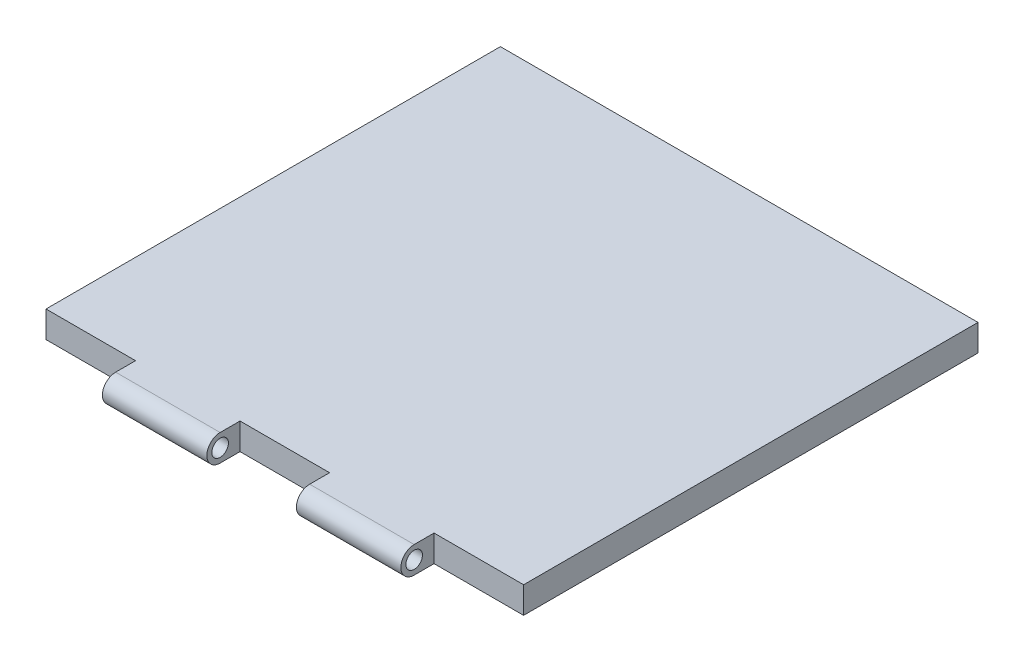
ISO-10303-21;
HEADER;
FILE_DESCRIPTION(('STEP AP214'),'2;1');
FILE_NAME('part.step','',(''),(''),'','','');
FILE_SCHEMA(('AUTOMOTIVE_DESIGN { 1 0 10303 214 1 1 1 1 }'));
ENDSEC;
DATA;
#1=APPLICATION_CONTEXT('core data for automotive mechanical design processes');
#2=APPLICATION_PROTOCOL_DEFINITION('international standard','automotive_design',2000,#1);
#3=PRODUCT_CONTEXT('',#1,'mechanical');
#4=PRODUCT('Part','Part','',(#3));
#5=PRODUCT_RELATED_PRODUCT_CATEGORY('part','',(#4));
#6=PRODUCT_DEFINITION_FORMATION('','',#4);
#7=PRODUCT_DEFINITION_CONTEXT('part definition',#1,'design');
#8=PRODUCT_DEFINITION('design','',#6,#7);
#9=PRODUCT_DEFINITION_SHAPE('','',#8);
#10=(LENGTH_UNIT() NAMED_UNIT(*) SI_UNIT(.MILLI.,.METRE.));
#11=(NAMED_UNIT(*) PLANE_ANGLE_UNIT() SI_UNIT($,.RADIAN.));
#12=(NAMED_UNIT(*) SI_UNIT($,.STERADIAN.) SOLID_ANGLE_UNIT());
#13=UNCERTAINTY_MEASURE_WITH_UNIT(LENGTH_MEASURE(1.E-05),#10,'distance_accuracy_value','');
#14=(GEOMETRIC_REPRESENTATION_CONTEXT(3) GLOBAL_UNCERTAINTY_ASSIGNED_CONTEXT((#13)) GLOBAL_UNIT_ASSIGNED_CONTEXT((#10,
#11,#12)) REPRESENTATION_CONTEXT('',''));
#15=CARTESIAN_POINT('',(0.,0.,0.));
#16=DIRECTION('',(0.,0.,1.));
#17=DIRECTION('',(1.,0.,0.));
#18=AXIS2_PLACEMENT_3D('',#15,#16,#17);
#19=CARTESIAN_POINT('',(36.,-1.14263199369577,-35.75));
#20=DIRECTION('',(0.,1.,0.));
#21=DIRECTION('',(0.,0.,1.));
#22=AXIS2_PLACEMENT_3D('',#19,#20,#21);
#23=PLANE('',#22);
#24=DIRECTION('',(0.,0.,-1.));
#25=VECTOR('',#24,1.);
#26=CARTESIAN_POINT('',(-22.5,-1.14263199369578,32.75));
#27=LINE('',#26,#25);
#28=CARTESIAN_POINT('',(-22.5,-1.14263199369578,35.75));
#29=VERTEX_POINT('',#28);
#30=CARTESIAN_POINT('',(-22.5,-1.14263199369578,32.75));
#31=VERTEX_POINT('',#30);
#32=EDGE_CURVE('E177',#29,#31,#27,.T.);
#33=ORIENTED_EDGE('',*,*,#32,.T.);
#34=DIRECTION('',(-1.,0.,0.));
#35=VECTOR('',#34,1.);
#36=CARTESIAN_POINT('',(-36.,-1.14263199369578,32.75));
#37=LINE('',#36,#35);
#38=CARTESIAN_POINT('',(-36.,-1.14263199369578,32.75));
#39=VERTEX_POINT('',#38);
#40=EDGE_CURVE('E180',#31,#39,#37,.T.);
#41=ORIENTED_EDGE('',*,*,#40,.T.);
#42=DIRECTION('',(0.,0.,-1.));
#43=VECTOR('',#42,1.);
#44=CARTESIAN_POINT('',(-36.,-1.14263199369577,-35.75));
#45=LINE('',#44,#43);
#46=CARTESIAN_POINT('',(-36.,-1.14263199369577,-35.75));
#47=VERTEX_POINT('',#46);
#48=EDGE_CURVE('E231',#39,#47,#45,.T.);
#49=ORIENTED_EDGE('',*,*,#48,.T.);
#50=DIRECTION('',(-1.,0.,0.));
#51=VECTOR('',#50,1.);
#52=CARTESIAN_POINT('',(36.,-1.14263199369577,-35.75));
#53=LINE('',#52,#51);
#54=CARTESIAN_POINT('',(36.,-1.14263199369577,-35.75));
#55=VERTEX_POINT('',#54);
#56=EDGE_CURVE('E252',#55,#47,#53,.T.);
#57=ORIENTED_EDGE('',*,*,#56,.F.);
#58=DIRECTION('',(0.,0.,-1.));
#59=VECTOR('',#58,1.);
#60=CARTESIAN_POINT('',(36.,-1.14263199369577,-35.75));
#61=LINE('',#60,#59);
#62=CARTESIAN_POINT('',(36.,-1.14263199369578,32.75));
#63=VERTEX_POINT('',#62);
#64=EDGE_CURVE('E232',#63,#55,#61,.T.);
#65=ORIENTED_EDGE('',*,*,#64,.F.);
#66=DIRECTION('',(-1.,0.,0.));
#67=VECTOR('',#66,1.);
#68=CARTESIAN_POINT('',(36.,-1.14263199369578,32.75));
#69=LINE('',#68,#67);
#70=CARTESIAN_POINT('',(22.5,-1.14263199369578,32.75));
#71=VERTEX_POINT('',#70);
#72=EDGE_CURVE('E196',#63,#71,#69,.T.);
#73=ORIENTED_EDGE('',*,*,#72,.T.);
#74=DIRECTION('',(0.,0.,1.));
#75=VECTOR('',#74,1.);
#76=CARTESIAN_POINT('',(22.5,-1.14263199369578,32.75));
#77=LINE('',#76,#75);
#78=CARTESIAN_POINT('',(22.5,-1.14263199369578,35.75));
#79=VERTEX_POINT('',#78);
#80=EDGE_CURVE('E199',#71,#79,#77,.T.);
#81=ORIENTED_EDGE('',*,*,#80,.T.);
#82=DIRECTION('',(-1.,0.,0.));
#83=VECTOR('',#82,1.);
#84=CARTESIAN_POINT('',(36.,-1.14263199369578,35.75));
#85=LINE('',#84,#83);
#86=CARTESIAN_POINT('',(6.75,-1.14263199369578,35.75));
#87=VERTEX_POINT('',#86);
#88=EDGE_CURVE('E11',#79,#87,#85,.T.);
#89=ORIENTED_EDGE('',*,*,#88,.T.);
#90=DIRECTION('',(0.,0.,-1.));
#91=VECTOR('',#90,1.);
#92=CARTESIAN_POINT('',(6.75,-1.14263199369578,32.75));
#93=LINE('',#92,#91);
#94=CARTESIAN_POINT('',(6.75,-1.14263199369578,32.75));
#95=VERTEX_POINT('',#94);
#96=EDGE_CURVE('E211',#87,#95,#93,.T.);
#97=ORIENTED_EDGE('',*,*,#96,.T.);
#98=DIRECTION('',(-1.,0.,0.));
#99=VECTOR('',#98,1.);
#100=CARTESIAN_POINT('',(-6.75,-1.14263199369578,32.75));
#101=LINE('',#100,#99);
#102=CARTESIAN_POINT('',(-6.75,-1.14263199369578,32.75));
#103=VERTEX_POINT('',#102);
#104=EDGE_CURVE('E214',#95,#103,#101,.T.);
#105=ORIENTED_EDGE('',*,*,#104,.T.);
#106=DIRECTION('',(0.,0.,1.));
#107=VECTOR('',#106,1.);
#108=CARTESIAN_POINT('',(-6.75,-1.14263199369578,32.75));
#109=LINE('',#108,#107);
#110=CARTESIAN_POINT('',(-6.75,-1.14263199369578,35.75));
#111=VERTEX_POINT('',#110);
#112=EDGE_CURVE('E208',#103,#111,#109,.T.);
#113=ORIENTED_EDGE('',*,*,#112,.T.);
#114=EDGE_CURVE('E44',#111,#29,#85,.T.);
#115=ORIENTED_EDGE('',*,*,#114,.T.);
#116=EDGE_LOOP('',(#33,#41,#49,#57,#65,#73,#81,#89,#97,#105,#113,#115));
#117=FACE_BOUND('',#116,.T.);
#118=DIRECTION('',(0.,0.,1.));
#119=VECTOR('',#118,1.);
#120=CARTESIAN_POINT('',(30.,-1.14263199369578,-19.8082953249715));
#121=LINE('',#120,#119);
#122=CARTESIAN_POINT('',(30.,-1.14263199369578,-30.8763302926644));
#123=VERTEX_POINT('',#122);
#124=CARTESIAN_POINT('',(30.,-1.14263199369578,-19.8082953249715));
#125=VERTEX_POINT('',#124);
#126=EDGE_CURVE('E151',#123,#125,#121,.T.);
#127=ORIENTED_EDGE('',*,*,#126,.F.);
#128=DIRECTION('',(-1.,0.,0.));
#129=VECTOR('',#128,1.);
#130=CARTESIAN_POINT('',(30.,-1.14263199369578,-30.8763302926644));
#131=LINE('',#130,#129);
#132=CARTESIAN_POINT('',(-30.,-1.14263199369578,-30.8763302926644));
#133=VERTEX_POINT('',#132);
#134=EDGE_CURVE('E168',#123,#133,#131,.T.);
#135=ORIENTED_EDGE('',*,*,#134,.T.);
#136=DIRECTION('',(0.,0.,1.));
#137=VECTOR('',#136,1.);
#138=CARTESIAN_POINT('',(-30.,-1.14263199369578,-19.8082953249715));
#139=LINE('',#138,#137);
#140=CARTESIAN_POINT('',(-30.,-1.14263199369577,-19.8082953249715));
#141=VERTEX_POINT('',#140);
#142=EDGE_CURVE('E162',#133,#141,#139,.T.);
#143=ORIENTED_EDGE('',*,*,#142,.T.);
#144=DIRECTION('',(-1.,0.,0.));
#145=VECTOR('',#144,1.);
#146=CARTESIAN_POINT('',(30.,-1.14263199369578,-19.8082953249715));
#147=LINE('',#146,#145);
#148=EDGE_CURVE('E52',#125,#141,#147,.T.);
#149=ORIENTED_EDGE('',*,*,#148,.F.);
#150=EDGE_LOOP('',(#127,#135,#143,#149));
#151=FACE_BOUND('',#150,.T.);
#152=ADVANCED_FACE('F35',(#117,#151),#23,.F.);
#153=CARTESIAN_POINT('',(36.,0.857368006304226,35.75));
#154=DIRECTION('',(-1.,0.,0.));
#155=DIRECTION('',(0.,0.,1.));
#156=AXIS2_PLACEMENT_3D('',#153,#154,#155);
#157=CYLINDRICAL_SURFACE('',#156,2.);
#158=DIRECTION('',(-1.,0.,0.));
#159=VECTOR('',#158,1.);
#160=CARTESIAN_POINT('',(36.,2.85736800630423,35.75));
#161=LINE('',#160,#159);
#162=CARTESIAN_POINT('',(-6.75,2.85736800630424,35.75));
#163=VERTEX_POINT('',#162);
#164=CARTESIAN_POINT('',(-22.5,2.85736800630423,35.75));
#165=VERTEX_POINT('',#164);
#166=EDGE_CURVE('E240',#163,#165,#161,.T.);
#167=ORIENTED_EDGE('',*,*,#166,.T.);
#168=CARTESIAN_POINT('',(-22.5,0.857368006304226,35.75));
#169=DIRECTION('',(1.,0.,0.));
#170=DIRECTION('',(0.,0.,-1.));
#171=AXIS2_PLACEMENT_3D('',#168,#169,#170);
#172=CIRCLE('',#171,2.);
#173=EDGE_CURVE('E229',#165,#29,#172,.T.);
#174=ORIENTED_EDGE('',*,*,#173,.T.);
#175=ORIENTED_EDGE('',*,*,#114,.F.);
#176=CARTESIAN_POINT('',(-6.75,0.857368006304226,35.75));
#177=DIRECTION('',(-1.,0.,0.));
#178=DIRECTION('',(0.,0.,1.));
#179=AXIS2_PLACEMENT_3D('',#176,#177,#178);
#180=CIRCLE('',#179,2.);
#181=EDGE_CURVE('E224',#111,#163,#180,.T.);
#182=ORIENTED_EDGE('',*,*,#181,.T.);
#183=EDGE_LOOP('',(#167,#174,#175,#182));
#184=FACE_BOUND('',#183,.T.);
#185=ADVANCED_FACE('F313',(#184),#157,.T.);
#186=CARTESIAN_POINT('',(36.,0.857368006304226,35.75));
#187=DIRECTION('',(-1.,0.,0.));
#188=DIRECTION('',(0.,0.,1.));
#189=AXIS2_PLACEMENT_3D('',#186,#187,#188);
#190=PLANE('',#189);
#191=DIRECTION('',(0.,0.,1.));
#192=VECTOR('',#191,1.);
#193=CARTESIAN_POINT('',(36.,2.85736800630423,35.75));
#194=LINE('',#193,#192);
#195=CARTESIAN_POINT('',(36.,2.85736800630424,-35.75));
#196=VERTEX_POINT('',#195);
#197=CARTESIAN_POINT('',(36.,2.85736800630423,32.75));
#198=VERTEX_POINT('',#197);
#199=EDGE_CURVE('E237',#196,#198,#194,.T.);
#200=ORIENTED_EDGE('',*,*,#199,.T.);
#201=DIRECTION('',(0.,1.,0.));
#202=VECTOR('',#201,1.);
#203=CARTESIAN_POINT('',(36.,-1.14263199369578,32.75));
#204=LINE('',#203,#202);
#205=EDGE_CURVE('E60',#63,#198,#204,.T.);
#206=ORIENTED_EDGE('',*,*,#205,.F.);
#207=ORIENTED_EDGE('',*,*,#64,.T.);
#208=DIRECTION('',(0.,1.,0.));
#209=VECTOR('',#208,1.);
#210=CARTESIAN_POINT('',(36.,2.85736800630424,-35.75));
#211=LINE('',#210,#209);
#212=EDGE_CURVE('E234',#55,#196,#211,.T.);
#213=ORIENTED_EDGE('',*,*,#212,.T.);
#214=EDGE_LOOP('',(#200,#206,#207,#213));
#215=FACE_BOUND('',#214,.T.);
#216=ADVANCED_FACE('F317',(#215),#190,.F.);
#217=CARTESIAN_POINT('',(-36.,0.857368006304226,35.75));
#218=DIRECTION('',(-1.,0.,0.));
#219=DIRECTION('',(0.,0.,1.));
#220=AXIS2_PLACEMENT_3D('',#217,#218,#219);
#221=PLANE('',#220);
#222=DIRECTION('',(0.,1.,0.));
#223=VECTOR('',#222,1.);
#224=CARTESIAN_POINT('',(-36.,-1.14263199369578,32.75));
#225=LINE('',#224,#223);
#226=CARTESIAN_POINT('',(-36.,2.85736800630424,32.75));
#227=VERTEX_POINT('',#226);
#228=EDGE_CURVE('E184',#39,#227,#225,.T.);
#229=ORIENTED_EDGE('',*,*,#228,.T.);
#230=DIRECTION('',(0.,0.,1.));
#231=VECTOR('',#230,1.);
#232=CARTESIAN_POINT('',(-36.,2.85736800630423,35.75));
#233=LINE('',#232,#231);
#234=CARTESIAN_POINT('',(-36.,2.85736800630424,-35.75));
#235=VERTEX_POINT('',#234);
#236=EDGE_CURVE('E235',#235,#227,#233,.T.);
#237=ORIENTED_EDGE('',*,*,#236,.F.);
#238=DIRECTION('',(0.,1.,0.));
#239=VECTOR('',#238,1.);
#240=CARTESIAN_POINT('',(-36.,2.85736800630424,-35.75));
#241=LINE('',#240,#239);
#242=EDGE_CURVE('E242',#47,#235,#241,.T.);
#243=ORIENTED_EDGE('',*,*,#242,.F.);
#244=ORIENTED_EDGE('',*,*,#48,.F.);
#245=EDGE_LOOP('',(#229,#237,#243,#244));
#246=FACE_BOUND('',#245,.T.);
#247=ADVANCED_FACE('F326',(#246),#221,.T.);
#248=CARTESIAN_POINT('',(22.5,0.857368006304226,35.75));
#249=DIRECTION('',(-1.,0.,0.));
#250=DIRECTION('',(0.,0.,1.));
#251=AXIS2_PLACEMENT_3D('',#248,#249,#250);
#252=CIRCLE('',#251,2.);
#253=CARTESIAN_POINT('',(22.5,2.85736800630424,35.75));
#254=VERTEX_POINT('',#253);
#255=EDGE_CURVE('E227',#79,#254,#252,.T.);
#256=ORIENTED_EDGE('',*,*,#255,.T.);
#257=CARTESIAN_POINT('',(6.75,2.85736800630423,35.75));
#258=VERTEX_POINT('',#257);
#259=EDGE_CURVE('E248',#254,#258,#161,.T.);
#260=ORIENTED_EDGE('',*,*,#259,.T.);
#261=CARTESIAN_POINT('',(6.75,0.857368006304226,35.75));
#262=DIRECTION('',(1.,0.,0.));
#263=DIRECTION('',(0.,0.,-1.));
#264=AXIS2_PLACEMENT_3D('',#261,#262,#263);
#265=CIRCLE('',#264,2.);
#266=EDGE_CURVE('E221',#258,#87,#265,.T.);
#267=ORIENTED_EDGE('',*,*,#266,.T.);
#268=ORIENTED_EDGE('',*,*,#88,.F.);
#269=EDGE_LOOP('',(#256,#260,#267,#268));
#270=FACE_BOUND('',#269,.T.);
#271=ADVANCED_FACE('F37',(#270),#157,.T.);
#272=CARTESIAN_POINT('',(36.,2.85736800630424,-35.75));
#273=DIRECTION('',(0.,0.,1.));
#274=DIRECTION('',(1.,0.,0.));
#275=AXIS2_PLACEMENT_3D('',#272,#273,#274);
#276=PLANE('',#275);
#277=ORIENTED_EDGE('',*,*,#242,.T.);
#278=DIRECTION('',(-1.,0.,0.));
#279=VECTOR('',#278,1.);
#280=CARTESIAN_POINT('',(36.,2.85736800630424,-35.75));
#281=LINE('',#280,#279);
#282=EDGE_CURVE('E249',#196,#235,#281,.T.);
#283=ORIENTED_EDGE('',*,*,#282,.F.);
#284=ORIENTED_EDGE('',*,*,#212,.F.);
#285=ORIENTED_EDGE('',*,*,#56,.T.);
#286=EDGE_LOOP('',(#277,#283,#284,#285));
#287=FACE_BOUND('',#286,.T.);
#288=ADVANCED_FACE('F320',(#287),#276,.F.);
#289=CARTESIAN_POINT('',(36.,2.85736800630423,35.75));
#290=DIRECTION('',(0.,-1.,0.));
#291=DIRECTION('',(0.,0.,-1.));
#292=AXIS2_PLACEMENT_3D('',#289,#290,#291);
#293=PLANE('',#292);
#294=ORIENTED_EDGE('',*,*,#236,.T.);
#295=DIRECTION('',(-1.,0.,0.));
#296=VECTOR('',#295,1.);
#297=CARTESIAN_POINT('',(-36.,2.85736800630424,32.75));
#298=LINE('',#297,#296);
#299=CARTESIAN_POINT('',(-22.5,2.85736800630424,32.75));
#300=VERTEX_POINT('',#299);
#301=EDGE_CURVE('E174',#300,#227,#298,.T.);
#302=ORIENTED_EDGE('',*,*,#301,.F.);
#303=DIRECTION('',(0.,0.,-1.));
#304=VECTOR('',#303,1.);
#305=CARTESIAN_POINT('',(-22.5,2.85736800630424,32.75));
#306=LINE('',#305,#304);
#307=EDGE_CURVE('E172',#165,#300,#306,.T.);
#308=ORIENTED_EDGE('',*,*,#307,.F.);
#309=ORIENTED_EDGE('',*,*,#166,.F.);
#310=DIRECTION('',(0.,0.,1.));
#311=VECTOR('',#310,1.);
#312=CARTESIAN_POINT('',(-6.75,2.85736800630424,32.75));
#313=LINE('',#312,#311);
#314=CARTESIAN_POINT('',(-6.75,2.85736800630424,32.75));
#315=VERTEX_POINT('',#314);
#316=EDGE_CURVE('E163',#315,#163,#313,.T.);
#317=ORIENTED_EDGE('',*,*,#316,.F.);
#318=DIRECTION('',(-1.,0.,0.));
#319=VECTOR('',#318,1.);
#320=CARTESIAN_POINT('',(-6.75,2.85736800630424,32.75));
#321=LINE('',#320,#319);
#322=CARTESIAN_POINT('',(6.75,2.85736800630424,32.75));
#323=VERTEX_POINT('',#322);
#324=EDGE_CURVE('E205',#323,#315,#321,.T.);
#325=ORIENTED_EDGE('',*,*,#324,.F.);
#326=DIRECTION('',(0.,0.,-1.));
#327=VECTOR('',#326,1.);
#328=CARTESIAN_POINT('',(6.75,2.85736800630424,32.75));
#329=LINE('',#328,#327);
#330=EDGE_CURVE('E166',#258,#323,#329,.T.);
#331=ORIENTED_EDGE('',*,*,#330,.F.);
#332=ORIENTED_EDGE('',*,*,#259,.F.);
#333=DIRECTION('',(0.,0.,1.));
#334=VECTOR('',#333,1.);
#335=CARTESIAN_POINT('',(22.5,2.85736800630424,32.75));
#336=LINE('',#335,#334);
#337=CARTESIAN_POINT('',(22.5,2.85736800630424,32.75));
#338=VERTEX_POINT('',#337);
#339=EDGE_CURVE('E192',#338,#254,#336,.T.);
#340=ORIENTED_EDGE('',*,*,#339,.F.);
#341=DIRECTION('',(-1.,0.,0.));
#342=VECTOR('',#341,1.);
#343=CARTESIAN_POINT('',(36.,2.85736800630424,32.75));
#344=LINE('',#343,#342);
#345=EDGE_CURVE('E190',#198,#338,#344,.T.);
#346=ORIENTED_EDGE('',*,*,#345,.F.);
#347=ORIENTED_EDGE('',*,*,#199,.F.);
#348=ORIENTED_EDGE('',*,*,#282,.T.);
#349=EDGE_LOOP('',(#294,#302,#308,#309,#317,#325,#331,#332,#340,#346,#347,#348));
#350=FACE_BOUND('',#349,.T.);
#351=ADVANCED_FACE('F288',(#350),#293,.F.);
#352=CARTESIAN_POINT('',(-6.75,-1.14263199369578,32.75));
#353=DIRECTION('',(-1.,0.,0.));
#354=DIRECTION('',(0.,0.,1.));
#355=AXIS2_PLACEMENT_3D('',#352,#353,#354);
#356=PLANE('',#355);
#357=CARTESIAN_POINT('',(-6.75,0.857368006304226,35.75));
#358=DIRECTION('',(-1.,0.,0.));
#359=DIRECTION('',(0.,0.,1.));
#360=AXIS2_PLACEMENT_3D('',#357,#358,#359);
#361=CIRCLE('',#360,1.25);
#362=CARTESIAN_POINT('',(-6.75,0.857368006304226,37.));
#363=VERTEX_POINT('',#362);
#364=EDGE_CURVE('E223',#363,#363,#361,.T.);
#365=ORIENTED_EDGE('',*,*,#364,.T.);
#366=EDGE_LOOP('',(#365));
#367=FACE_BOUND('',#366,.T.);
#368=ORIENTED_EDGE('',*,*,#181,.F.);
#369=ORIENTED_EDGE('',*,*,#112,.F.);
#370=DIRECTION('',(0.,1.,0.));
#371=VECTOR('',#370,1.);
#372=CARTESIAN_POINT('',(-6.75,-1.14263199369578,32.75));
#373=LINE('',#372,#371);
#374=EDGE_CURVE('E193',#103,#315,#373,.T.);
#375=ORIENTED_EDGE('',*,*,#374,.T.);
#376=ORIENTED_EDGE('',*,*,#316,.T.);
#377=EDGE_LOOP('',(#368,#369,#375,#376));
#378=FACE_BOUND('',#377,.T.);
#379=ADVANCED_FACE('F277',(#367,#378),#356,.F.);
#380=CARTESIAN_POINT('',(6.75,-1.14263199369578,32.75));
#381=DIRECTION('',(1.,0.,0.));
#382=DIRECTION('',(0.,0.,-1.));
#383=AXIS2_PLACEMENT_3D('',#380,#381,#382);
#384=PLANE('',#383);
#385=CARTESIAN_POINT('',(6.75,0.857368006304226,35.75));
#386=DIRECTION('',(1.,0.,0.));
#387=DIRECTION('',(0.,0.,-1.));
#388=AXIS2_PLACEMENT_3D('',#385,#386,#387);
#389=CIRCLE('',#388,1.25);
#390=CARTESIAN_POINT('',(6.75,0.857368006304226,34.5));
#391=VERTEX_POINT('',#390);
#392=EDGE_CURVE('E187',#391,#391,#389,.T.);
#393=ORIENTED_EDGE('',*,*,#392,.T.);
#394=EDGE_LOOP('',(#393));
#395=FACE_BOUND('',#394,.T.);
#396=ORIENTED_EDGE('',*,*,#330,.T.);
#397=DIRECTION('',(0.,1.,0.));
#398=VECTOR('',#397,1.);
#399=CARTESIAN_POINT('',(6.75,-1.14263199369578,32.75));
#400=LINE('',#399,#398);
#401=EDGE_CURVE('E217',#95,#323,#400,.T.);
#402=ORIENTED_EDGE('',*,*,#401,.F.);
#403=ORIENTED_EDGE('',*,*,#96,.F.);
#404=ORIENTED_EDGE('',*,*,#266,.F.);
#405=EDGE_LOOP('',(#396,#402,#403,#404));
#406=FACE_BOUND('',#405,.T.);
#407=ADVANCED_FACE('F273',(#395,#406),#384,.F.);
#408=CARTESIAN_POINT('',(-6.75,-1.14263199369578,32.75));
#409=DIRECTION('',(0.,0.,-1.));
#410=DIRECTION('',(-1.,0.,0.));
#411=AXIS2_PLACEMENT_3D('',#408,#409,#410);
#412=PLANE('',#411);
#413=ORIENTED_EDGE('',*,*,#374,.F.);
#414=ORIENTED_EDGE('',*,*,#104,.F.);
#415=ORIENTED_EDGE('',*,*,#401,.T.);
#416=ORIENTED_EDGE('',*,*,#324,.T.);
#417=EDGE_LOOP('',(#413,#414,#415,#416));
#418=FACE_BOUND('',#417,.T.);
#419=ADVANCED_FACE('F276',(#418),#412,.F.);
#420=CARTESIAN_POINT('',(36.,0.857368006304226,35.75));
#421=DIRECTION('',(-1.,0.,0.));
#422=DIRECTION('',(0.,0.,1.));
#423=AXIS2_PLACEMENT_3D('',#420,#421,#422);
#424=CYLINDRICAL_SURFACE('',#423,1.25);
#425=CARTESIAN_POINT('',(-22.5,0.857368006304226,35.75));
#426=DIRECTION('',(1.,0.,0.));
#427=DIRECTION('',(0.,0.,-1.));
#428=AXIS2_PLACEMENT_3D('',#425,#426,#427);
#429=CIRCLE('',#428,1.25);
#430=CARTESIAN_POINT('',(-22.5,0.857368006304226,34.5));
#431=VERTEX_POINT('',#430);
#432=EDGE_CURVE('E39',#431,#431,#429,.T.);
#433=ORIENTED_EDGE('',*,*,#432,.F.);
#434=EDGE_LOOP('',(#433));
#435=FACE_BOUND('',#434,.T.);
#436=ORIENTED_EDGE('',*,*,#364,.F.);
#437=EDGE_LOOP('',(#436));
#438=FACE_BOUND('',#437,.T.);
#439=ADVANCED_FACE('F270',(#435,#438),#424,.F.);
#440=CARTESIAN_POINT('',(22.5,-1.14263199369578,32.75));
#441=DIRECTION('',(-1.,0.,0.));
#442=DIRECTION('',(0.,0.,1.));
#443=AXIS2_PLACEMENT_3D('',#440,#441,#442);
#444=PLANE('',#443);
#445=CARTESIAN_POINT('',(22.5,0.857368006304226,35.75));
#446=DIRECTION('',(-1.,0.,0.));
#447=DIRECTION('',(0.,0.,1.));
#448=AXIS2_PLACEMENT_3D('',#445,#446,#447);
#449=CIRCLE('',#448,1.25);
#450=CARTESIAN_POINT('',(22.5,0.857368006304226,37.));
#451=VERTEX_POINT('',#450);
#452=EDGE_CURVE('E226',#451,#451,#449,.T.);
#453=ORIENTED_EDGE('',*,*,#452,.T.);
#454=EDGE_LOOP('',(#453));
#455=FACE_BOUND('',#454,.T.);
#456=ORIENTED_EDGE('',*,*,#255,.F.);
#457=ORIENTED_EDGE('',*,*,#80,.F.);
#458=DIRECTION('',(0.,1.,0.));
#459=VECTOR('',#458,1.);
#460=CARTESIAN_POINT('',(22.5,-1.14263199369578,32.75));
#461=LINE('',#460,#459);
#462=EDGE_CURVE('E175',#71,#338,#461,.T.);
#463=ORIENTED_EDGE('',*,*,#462,.T.);
#464=ORIENTED_EDGE('',*,*,#339,.T.);
#465=EDGE_LOOP('',(#456,#457,#463,#464));
#466=FACE_BOUND('',#465,.T.);
#467=ADVANCED_FACE('F262',(#455,#466),#444,.F.);
#468=CARTESIAN_POINT('',(36.,-1.14263199369578,32.75));
#469=DIRECTION('',(0.,0.,-1.));
#470=DIRECTION('',(-1.,0.,0.));
#471=AXIS2_PLACEMENT_3D('',#468,#469,#470);
#472=PLANE('',#471);
#473=ORIENTED_EDGE('',*,*,#462,.F.);
#474=ORIENTED_EDGE('',*,*,#72,.F.);
#475=ORIENTED_EDGE('',*,*,#205,.T.);
#476=ORIENTED_EDGE('',*,*,#345,.T.);
#477=EDGE_LOOP('',(#473,#474,#475,#476));
#478=FACE_BOUND('',#477,.T.);
#479=ADVANCED_FACE('F300',(#478),#472,.F.);
#480=CARTESIAN_POINT('',(-22.5,-1.14263199369578,32.75));
#481=DIRECTION('',(1.,0.,0.));
#482=DIRECTION('',(0.,0.,-1.));
#483=AXIS2_PLACEMENT_3D('',#480,#481,#482);
#484=PLANE('',#483);
#485=ORIENTED_EDGE('',*,*,#432,.T.);
#486=EDGE_LOOP('',(#485));
#487=FACE_BOUND('',#486,.T.);
#488=ORIENTED_EDGE('',*,*,#307,.T.);
#489=DIRECTION('',(0.,1.,0.));
#490=VECTOR('',#489,1.);
#491=CARTESIAN_POINT('',(-22.5,-1.14263199369578,32.75));
#492=LINE('',#491,#490);
#493=EDGE_CURVE('E183',#31,#300,#492,.T.);
#494=ORIENTED_EDGE('',*,*,#493,.F.);
#495=ORIENTED_EDGE('',*,*,#32,.F.);
#496=ORIENTED_EDGE('',*,*,#173,.F.);
#497=EDGE_LOOP('',(#488,#494,#495,#496));
#498=FACE_BOUND('',#497,.T.);
#499=ADVANCED_FACE('F302',(#487,#498),#484,.F.);
#500=CARTESIAN_POINT('',(-36.,-1.14263199369578,32.75));
#501=DIRECTION('',(0.,0.,-1.));
#502=DIRECTION('',(-1.,0.,0.));
#503=AXIS2_PLACEMENT_3D('',#500,#501,#502);
#504=PLANE('',#503);
#505=ORIENTED_EDGE('',*,*,#228,.F.);
#506=ORIENTED_EDGE('',*,*,#40,.F.);
#507=ORIENTED_EDGE('',*,*,#493,.T.);
#508=ORIENTED_EDGE('',*,*,#301,.T.);
#509=EDGE_LOOP('',(#505,#506,#507,#508));
#510=FACE_BOUND('',#509,.T.);
#511=ADVANCED_FACE('F268',(#510),#504,.F.);
#512=ORIENTED_EDGE('',*,*,#452,.F.);
#513=EDGE_LOOP('',(#512));
#514=FACE_BOUND('',#513,.T.);
#515=ORIENTED_EDGE('',*,*,#392,.F.);
#516=EDGE_LOOP('',(#515));
#517=FACE_BOUND('',#516,.T.);
#518=ADVANCED_FACE('F265',(#514,#517),#424,.F.);
#519=CARTESIAN_POINT('',(30.,-3.87867255898379,-30.8763302926644));
#520=DIRECTION('',(0.,0.9707782427587,-0.239978339410728));
#521=DIRECTION('',(0.,0.239978339410729,0.9707782427587));
#522=AXIS2_PLACEMENT_3D('',#519,#520,#521);
#523=PLANE('',#522);
#524=DIRECTION('',(0.,-0.239978339410729,-0.9707782427587));
#525=VECTOR('',#524,1.);
#526=CARTESIAN_POINT('',(-30.,-3.87867255898379,-30.8763302926644));
#527=LINE('',#526,#525);
#528=CARTESIAN_POINT('',(-30.,-3.87867255898379,-30.8763302926644));
#529=VERTEX_POINT('',#528);
#530=EDGE_CURVE('E486',#141,#529,#527,.T.);
#531=ORIENTED_EDGE('',*,*,#530,.T.);
#532=DIRECTION('',(-1.,0.,0.));
#533=VECTOR('',#532,1.);
#534=CARTESIAN_POINT('',(30.,-3.87867255898379,-30.8763302926644));
#535=LINE('',#534,#533);
#536=CARTESIAN_POINT('',(30.,-3.87867255898379,-30.8763302926644));
#537=VERTEX_POINT('',#536);
#538=EDGE_CURVE('E147',#537,#529,#535,.T.);
#539=ORIENTED_EDGE('',*,*,#538,.F.);
#540=DIRECTION('',(0.,-0.239978339410729,-0.9707782427587));
#541=VECTOR('',#540,1.);
#542=CARTESIAN_POINT('',(30.,-3.87867255898379,-30.8763302926644));
#543=LINE('',#542,#541);
#544=EDGE_CURVE('E143',#125,#537,#543,.T.);
#545=ORIENTED_EDGE('',*,*,#544,.F.);
#546=ORIENTED_EDGE('',*,*,#148,.T.);
#547=EDGE_LOOP('',(#531,#539,#545,#546));
#548=FACE_BOUND('',#547,.T.);
#549=ADVANCED_FACE('F145',(#548),#523,.F.);
#550=CARTESIAN_POINT('',(30.,-1.14263199369578,-30.8763302926644));
#551=DIRECTION('',(0.,0.,1.));
#552=DIRECTION('',(1.,0.,0.));
#553=AXIS2_PLACEMENT_3D('',#550,#551,#552);
#554=PLANE('',#553);
#555=DIRECTION('',(0.,1.,0.));
#556=VECTOR('',#555,1.);
#557=CARTESIAN_POINT('',(-30.,-1.14263199369578,-30.8763302926644));
#558=LINE('',#557,#556);
#559=EDGE_CURVE('E158',#529,#133,#558,.T.);
#560=ORIENTED_EDGE('',*,*,#559,.T.);
#561=ORIENTED_EDGE('',*,*,#134,.F.);
#562=DIRECTION('',(0.,1.,0.));
#563=VECTOR('',#562,1.);
#564=CARTESIAN_POINT('',(30.,-1.14263199369578,-30.8763302926644));
#565=LINE('',#564,#563);
#566=EDGE_CURVE('E150',#537,#123,#565,.T.);
#567=ORIENTED_EDGE('',*,*,#566,.F.);
#568=ORIENTED_EDGE('',*,*,#538,.T.);
#569=EDGE_LOOP('',(#560,#561,#567,#568));
#570=FACE_BOUND('',#569,.T.);
#571=ADVANCED_FACE('F365',(#570),#554,.F.);
#572=CARTESIAN_POINT('',(30.,0.,0.));
#573=DIRECTION('',(-1.,0.,0.));
#574=DIRECTION('',(0.,0.,1.));
#575=AXIS2_PLACEMENT_3D('',#572,#573,#574);
#576=PLANE('',#575);
#577=ORIENTED_EDGE('',*,*,#126,.T.);
#578=ORIENTED_EDGE('',*,*,#544,.T.);
#579=ORIENTED_EDGE('',*,*,#566,.T.);
#580=EDGE_LOOP('',(#577,#578,#579));
#581=FACE_BOUND('',#580,.T.);
#582=ADVANCED_FACE('F154',(#581),#576,.F.);
#583=CARTESIAN_POINT('',(-30.,0.,0.));
#584=DIRECTION('',(-1.,0.,0.));
#585=DIRECTION('',(0.,0.,1.));
#586=AXIS2_PLACEMENT_3D('',#583,#584,#585);
#587=PLANE('',#586);
#588=ORIENTED_EDGE('',*,*,#142,.F.);
#589=ORIENTED_EDGE('',*,*,#559,.F.);
#590=ORIENTED_EDGE('',*,*,#530,.F.);
#591=EDGE_LOOP('',(#588,#589,#590));
#592=FACE_BOUND('',#591,.T.);
#593=ADVANCED_FACE('F369',(#592),#587,.T.);
#594=CLOSED_SHELL('',(#152,#185,#216,#247,#271,#288,#351,#379,#407,#419,#439,#467,#479,#499,
#511,#518,#549,#571,#582,#593));
#595=MANIFOLD_SOLID_BREP('B2',#594);
#596=ADVANCED_BREP_SHAPE_REPRESENTATION('',(#18,#595),#14);
#597=SHAPE_DEFINITION_REPRESENTATION(#9,#596);
ENDSEC;
END-ISO-10303-21;
